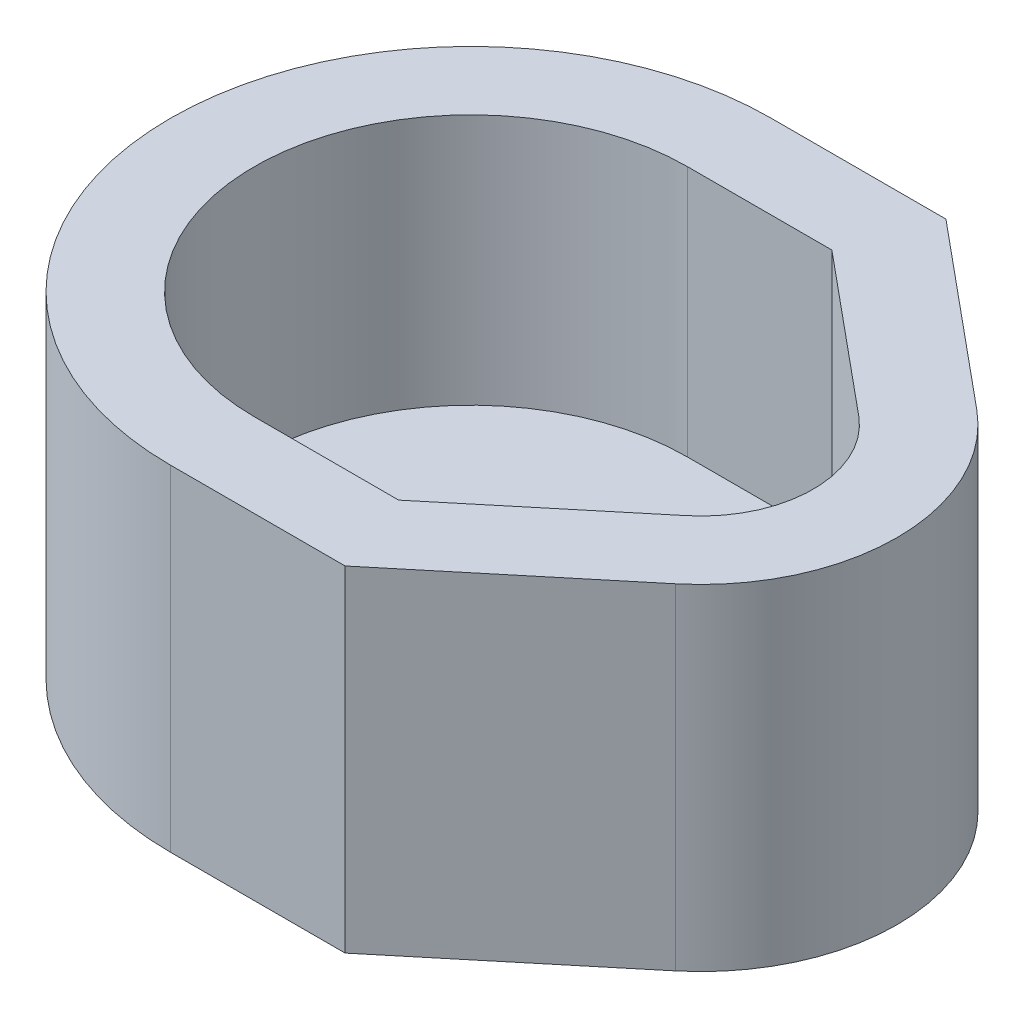
ISO-10303-21;
HEADER;
FILE_DESCRIPTION(('STEP AP214'),'2;1');
FILE_NAME('part.step','',(''),(''),'','','');
FILE_SCHEMA(('AUTOMOTIVE_DESIGN { 1 0 10303 214 1 1 1 1 }'));
ENDSEC;
DATA;
#1=APPLICATION_CONTEXT('core data for automotive mechanical design processes');
#2=APPLICATION_PROTOCOL_DEFINITION('international standard','automotive_design',2000,#1);
#3=PRODUCT_CONTEXT('',#1,'mechanical');
#4=PRODUCT('Part','Part','',(#3));
#5=PRODUCT_RELATED_PRODUCT_CATEGORY('part','',(#4));
#6=PRODUCT_DEFINITION_FORMATION('','',#4);
#7=PRODUCT_DEFINITION_CONTEXT('part definition',#1,'design');
#8=PRODUCT_DEFINITION('design','',#6,#7);
#9=PRODUCT_DEFINITION_SHAPE('','',#8);
#10=(LENGTH_UNIT() NAMED_UNIT(*) SI_UNIT(.MILLI.,.METRE.));
#11=(NAMED_UNIT(*) PLANE_ANGLE_UNIT() SI_UNIT($,.RADIAN.));
#12=(NAMED_UNIT(*) SI_UNIT($,.STERADIAN.) SOLID_ANGLE_UNIT());
#13=UNCERTAINTY_MEASURE_WITH_UNIT(LENGTH_MEASURE(1.E-05),#10,'distance_accuracy_value','');
#14=(GEOMETRIC_REPRESENTATION_CONTEXT(3) GLOBAL_UNCERTAINTY_ASSIGNED_CONTEXT((#13)) GLOBAL_UNIT_ASSIGNED_CONTEXT((#10,
#11,#12)) REPRESENTATION_CONTEXT('',''));
#15=CARTESIAN_POINT('',(0.,0.,0.));
#16=DIRECTION('',(0.,0.,1.));
#17=DIRECTION('',(1.,0.,0.));
#18=AXIS2_PLACEMENT_3D('',#15,#16,#17);
#19=CARTESIAN_POINT('',(0.,25.4,-22.7584));
#20=DIRECTION('',(0.,-1.,0.));
#21=DIRECTION('',(0.,0.,-1.));
#22=AXIS2_PLACEMENT_3D('',#19,#20,#21);
#23=CYLINDRICAL_SURFACE('',#22,22.7584);
#24=CARTESIAN_POINT('',(0.,0.,-22.7584));
#25=DIRECTION('',(0.,1.,0.));
#26=DIRECTION('',(0.,0.,1.));
#27=AXIS2_PLACEMENT_3D('',#24,#25,#26);
#28=CIRCLE('',#27,22.7584);
#29=CARTESIAN_POINT('',(0.,0.,-45.5168));
#30=VERTEX_POINT('',#29);
#31=CARTESIAN_POINT('',(0.,0.,0.));
#32=VERTEX_POINT('',#31);
#33=EDGE_CURVE('E134',#30,#32,#28,.T.);
#34=ORIENTED_EDGE('',*,*,#33,.T.);
#35=DIRECTION('',(0.,-1.,0.));
#36=VECTOR('',#35,1.);
#37=CARTESIAN_POINT('',(0.,25.4,0.));
#38=LINE('',#37,#36);
#39=CARTESIAN_POINT('',(0.,25.4,0.));
#40=VERTEX_POINT('',#39);
#41=EDGE_CURVE('E11',#40,#32,#38,.T.);
#42=ORIENTED_EDGE('',*,*,#41,.F.);
#43=CARTESIAN_POINT('',(0.,25.4,-22.7584));
#44=DIRECTION('',(0.,1.,0.));
#45=DIRECTION('',(0.,0.,1.));
#46=AXIS2_PLACEMENT_3D('',#43,#44,#45);
#47=CIRCLE('',#46,22.7584);
#48=CARTESIAN_POINT('',(0.,25.4,-45.5168));
#49=VERTEX_POINT('',#48);
#50=EDGE_CURVE('E146',#49,#40,#47,.T.);
#51=ORIENTED_EDGE('',*,*,#50,.F.);
#52=DIRECTION('',(0.,-1.,0.));
#53=VECTOR('',#52,1.);
#54=CARTESIAN_POINT('',(0.,25.4,-45.5168));
#55=LINE('',#54,#53);
#56=EDGE_CURVE('E130',#49,#30,#55,.T.);
#57=ORIENTED_EDGE('',*,*,#56,.T.);
#58=EDGE_LOOP('',(#34,#42,#51,#57));
#59=FACE_BOUND('',#58,.T.);
#60=ADVANCED_FACE('F39',(#59),#23,.T.);
#61=CARTESIAN_POINT('',(0.,25.4,0.));
#62=DIRECTION('',(0.,0.,-1.));
#63=DIRECTION('',(-1.,0.,0.));
#64=AXIS2_PLACEMENT_3D('',#61,#62,#63);
#65=PLANE('',#64);
#66=DIRECTION('',(1.,0.,0.));
#67=VECTOR('',#66,1.);
#68=CARTESIAN_POINT('',(0.,0.,0.));
#69=LINE('',#68,#67);
#70=CARTESIAN_POINT('',(13.2334,0.,0.));
#71=VERTEX_POINT('',#70);
#72=EDGE_CURVE('E137',#32,#71,#69,.T.);
#73=ORIENTED_EDGE('',*,*,#72,.T.);
#74=DIRECTION('',(0.,-1.,0.));
#75=VECTOR('',#74,1.);
#76=CARTESIAN_POINT('',(13.2334,25.4,0.));
#77=LINE('',#76,#75);
#78=CARTESIAN_POINT('',(13.2334,25.4,0.));
#79=VERTEX_POINT('',#78);
#80=EDGE_CURVE('E46',#79,#71,#77,.T.);
#81=ORIENTED_EDGE('',*,*,#80,.F.);
#82=DIRECTION('',(1.,0.,0.));
#83=VECTOR('',#82,1.);
#84=CARTESIAN_POINT('',(0.,25.4,0.));
#85=LINE('',#84,#83);
#86=EDGE_CURVE('E97',#40,#79,#85,.T.);
#87=ORIENTED_EDGE('',*,*,#86,.F.);
#88=ORIENTED_EDGE('',*,*,#41,.T.);
#89=EDGE_LOOP('',(#73,#81,#87,#88));
#90=FACE_BOUND('',#89,.T.);
#91=ADVANCED_FACE('F296',(#90),#65,.F.);
#92=CARTESIAN_POINT('',(13.2334,25.4,0.));
#93=DIRECTION('',(-0.638248134360733,0.,-0.769830708003418));
#94=DIRECTION('',(-0.769830708003418,0.,0.638248134360733));
#95=AXIS2_PLACEMENT_3D('',#92,#93,#94);
#96=PLANE('',#95);
#97=DIRECTION('',(0.769830708003418,0.,-0.638248134360733));
#98=VECTOR('',#97,1.);
#99=CARTESIAN_POINT('',(13.2334,0.,0.));
#100=LINE('',#99,#98);
#101=CARTESIAN_POINT('',(26.921911774547,0.,-11.3488160597521));
#102=VERTEX_POINT('',#101);
#103=EDGE_CURVE('E140',#71,#102,#100,.T.);
#104=ORIENTED_EDGE('',*,*,#103,.T.);
#105=DIRECTION('',(0.,-1.,0.));
#106=VECTOR('',#105,1.);
#107=CARTESIAN_POINT('',(26.921911774547,25.4,-11.3488160597521));
#108=LINE('',#107,#106);
#109=CARTESIAN_POINT('',(26.921911774547,25.4,-11.3488160597521));
#110=VERTEX_POINT('',#109);
#111=EDGE_CURVE('E125',#110,#102,#108,.T.);
#112=ORIENTED_EDGE('',*,*,#111,.F.);
#113=DIRECTION('',(0.769830708003418,0.,-0.638248134360733));
#114=VECTOR('',#113,1.);
#115=CARTESIAN_POINT('',(13.2334,25.4,0.));
#116=LINE('',#115,#114);
#117=EDGE_CURVE('E113',#79,#110,#116,.T.);
#118=ORIENTED_EDGE('',*,*,#117,.F.);
#119=ORIENTED_EDGE('',*,*,#80,.T.);
#120=EDGE_LOOP('',(#104,#112,#118,#119));
#121=FACE_BOUND('',#120,.T.);
#122=ADVANCED_FACE('F152',(#121),#96,.F.);
#123=CARTESIAN_POINT('',(17.4625,25.4,-22.7584));
#124=DIRECTION('',(0.,-1.,0.));
#125=DIRECTION('',(0.,0.,-1.));
#126=AXIS2_PLACEMENT_3D('',#123,#124,#125);
#127=CYLINDRICAL_SURFACE('',#126,14.8209);
#128=CARTESIAN_POINT('',(17.4625,0.,-22.7584));
#129=DIRECTION('',(0.,1.,0.));
#130=DIRECTION('',(0.,0.,1.));
#131=AXIS2_PLACEMENT_3D('',#128,#129,#130);
#132=CIRCLE('',#131,14.8209);
#133=CARTESIAN_POINT('',(26.921911774547,0.,-34.1679839402478));
#134=VERTEX_POINT('',#133);
#135=EDGE_CURVE('E122',#102,#134,#132,.T.);
#136=ORIENTED_EDGE('',*,*,#135,.T.);
#137=DIRECTION('',(0.,-1.,0.));
#138=VECTOR('',#137,1.);
#139=CARTESIAN_POINT('',(26.921911774547,25.4,-34.1679839402478));
#140=LINE('',#139,#138);
#141=CARTESIAN_POINT('',(26.921911774547,25.4,-34.1679839402478));
#142=VERTEX_POINT('',#141);
#143=EDGE_CURVE('E119',#142,#134,#140,.T.);
#144=ORIENTED_EDGE('',*,*,#143,.F.);
#145=CARTESIAN_POINT('',(17.4625,25.4,-22.7584));
#146=DIRECTION('',(0.,1.,0.));
#147=DIRECTION('',(0.,0.,1.));
#148=AXIS2_PLACEMENT_3D('',#145,#146,#147);
#149=CIRCLE('',#148,14.8209);
#150=EDGE_CURVE('E106',#110,#142,#149,.T.);
#151=ORIENTED_EDGE('',*,*,#150,.F.);
#152=ORIENTED_EDGE('',*,*,#111,.T.);
#153=EDGE_LOOP('',(#136,#144,#151,#152));
#154=FACE_BOUND('',#153,.T.);
#155=ADVANCED_FACE('F120',(#154),#127,.T.);
#156=CARTESIAN_POINT('',(26.921911774547,25.4,-34.1679839402478));
#157=DIRECTION('',(-0.638248134360736,0.,0.769830708003416));
#158=DIRECTION('',(0.769830708003416,0.,0.638248134360736));
#159=AXIS2_PLACEMENT_3D('',#156,#157,#158);
#160=PLANE('',#159);
#161=DIRECTION('',(-0.769830708003416,0.,-0.638248134360736));
#162=VECTOR('',#161,1.);
#163=CARTESIAN_POINT('',(26.921911774547,0.,-34.1679839402478));
#164=LINE('',#163,#162);
#165=CARTESIAN_POINT('',(13.2334000000001,0.,-45.5168));
#166=VERTEX_POINT('',#165);
#167=EDGE_CURVE('E143',#134,#166,#164,.T.);
#168=ORIENTED_EDGE('',*,*,#167,.T.);
#169=DIRECTION('',(0.,-1.,0.));
#170=VECTOR('',#169,1.);
#171=CARTESIAN_POINT('',(13.2334000000001,25.4,-45.5168));
#172=LINE('',#171,#170);
#173=CARTESIAN_POINT('',(13.2334000000001,25.4,-45.5168));
#174=VERTEX_POINT('',#173);
#175=EDGE_CURVE('E126',#174,#166,#172,.T.);
#176=ORIENTED_EDGE('',*,*,#175,.F.);
#177=DIRECTION('',(-0.769830708003416,0.,-0.638248134360736));
#178=VECTOR('',#177,1.);
#179=CARTESIAN_POINT('',(26.921911774547,25.4,-34.1679839402478));
#180=LINE('',#179,#178);
#181=EDGE_CURVE('E110',#142,#174,#180,.T.);
#182=ORIENTED_EDGE('',*,*,#181,.F.);
#183=ORIENTED_EDGE('',*,*,#143,.T.);
#184=EDGE_LOOP('',(#168,#176,#182,#183));
#185=FACE_BOUND('',#184,.T.);
#186=ADVANCED_FACE('F128',(#185),#160,.F.);
#187=CARTESIAN_POINT('',(0.,25.4,-45.5168));
#188=DIRECTION('',(0.,0.,1.));
#189=DIRECTION('',(1.,0.,0.));
#190=AXIS2_PLACEMENT_3D('',#187,#188,#189);
#191=PLANE('',#190);
#192=DIRECTION('',(-1.,0.,0.));
#193=VECTOR('',#192,1.);
#194=CARTESIAN_POINT('',(0.,0.,-45.5168));
#195=LINE('',#194,#193);
#196=EDGE_CURVE('E89',#166,#30,#195,.T.);
#197=ORIENTED_EDGE('',*,*,#196,.T.);
#198=ORIENTED_EDGE('',*,*,#56,.F.);
#199=DIRECTION('',(-1.,0.,0.));
#200=VECTOR('',#199,1.);
#201=CARTESIAN_POINT('',(0.,25.4,-45.5168));
#202=LINE('',#201,#200);
#203=EDGE_CURVE('E62',#174,#49,#202,.T.);
#204=ORIENTED_EDGE('',*,*,#203,.F.);
#205=ORIENTED_EDGE('',*,*,#175,.T.);
#206=EDGE_LOOP('',(#197,#198,#204,#205));
#207=FACE_BOUND('',#206,.T.);
#208=ADVANCED_FACE('F156',(#207),#191,.F.);
#209=CARTESIAN_POINT('',(0.,25.4,-22.7584));
#210=DIRECTION('',(0.,1.,0.));
#211=DIRECTION('',(0.,0.,1.));
#212=AXIS2_PLACEMENT_3D('',#209,#210,#211);
#213=PLANE('',#212);
#214=CARTESIAN_POINT('',(0.,25.4,-22.7584));
#215=DIRECTION('',(0.,1.,0.));
#216=DIRECTION('',(0.,0.,1.));
#217=AXIS2_PLACEMENT_3D('',#214,#215,#216);
#218=CIRCLE('',#217,16.4084);
#219=CARTESIAN_POINT('',(0.,25.4,-39.1668));
#220=VERTEX_POINT('',#219);
#221=CARTESIAN_POINT('',(0.,25.4,-6.35));
#222=VERTEX_POINT('',#221);
#223=EDGE_CURVE('E177',#220,#222,#218,.T.);
#224=ORIENTED_EDGE('',*,*,#223,.F.);
#225=DIRECTION('',(-1.,0.,0.));
#226=VECTOR('',#225,1.);
#227=CARTESIAN_POINT('',(0.,25.4,-39.1668));
#228=LINE('',#227,#226);
#229=CARTESIAN_POINT('',(10.9434207184434,25.4,-39.1668));
#230=VERTEX_POINT('',#229);
#231=EDGE_CURVE('E163',#230,#220,#228,.T.);
#232=ORIENTED_EDGE('',*,*,#231,.F.);
#233=DIRECTION('',(-0.769830708003416,0.,-0.638248134360736));
#234=VECTOR('',#233,1.);
#235=CARTESIAN_POINT('',(22.8690361213564,25.4,-29.2795589444261));
#236=LINE('',#235,#234);
#237=CARTESIAN_POINT('',(22.8690361213564,25.4,-29.2795589444261));
#238=VERTEX_POINT('',#237);
#239=EDGE_CURVE('E166',#238,#230,#236,.T.);
#240=ORIENTED_EDGE('',*,*,#239,.F.);
#241=CARTESIAN_POINT('',(17.4625,25.4,-22.7584));
#242=DIRECTION('',(0.,1.,0.));
#243=DIRECTION('',(0.,0.,1.));
#244=AXIS2_PLACEMENT_3D('',#241,#242,#243);
#245=CIRCLE('',#244,8.4709);
#246=CARTESIAN_POINT('',(22.8690361213563,25.4,-16.2372410555739));
#247=VERTEX_POINT('',#246);
#248=EDGE_CURVE('E168',#247,#238,#245,.T.);
#249=ORIENTED_EDGE('',*,*,#248,.F.);
#250=DIRECTION('',(0.769830708003418,0.,-0.638248134360733));
#251=VECTOR('',#250,1.);
#252=CARTESIAN_POINT('',(9.18052434680934,25.4,-4.8884249958217));
#253=LINE('',#252,#251);
#254=CARTESIAN_POINT('',(10.9434207184433,25.4,-6.35));
#255=VERTEX_POINT('',#254);
#256=EDGE_CURVE('E171',#255,#247,#253,.T.);
#257=ORIENTED_EDGE('',*,*,#256,.F.);
#258=DIRECTION('',(1.,0.,0.));
#259=VECTOR('',#258,1.);
#260=CARTESIAN_POINT('',(0.,25.4,-6.35));
#261=LINE('',#260,#259);
#262=EDGE_CURVE('E174',#222,#255,#261,.T.);
#263=ORIENTED_EDGE('',*,*,#262,.F.);
#264=EDGE_LOOP('',(#224,#232,#240,#249,#257,#263));
#265=FACE_BOUND('',#264,.T.);
#266=ORIENTED_EDGE('',*,*,#50,.T.);
#267=ORIENTED_EDGE('',*,*,#86,.T.);
#268=ORIENTED_EDGE('',*,*,#117,.T.);
#269=ORIENTED_EDGE('',*,*,#150,.T.);
#270=ORIENTED_EDGE('',*,*,#181,.T.);
#271=ORIENTED_EDGE('',*,*,#203,.T.);
#272=EDGE_LOOP('',(#266,#267,#268,#269,#270,#271));
#273=FACE_BOUND('',#272,.T.);
#274=ADVANCED_FACE('F108',(#265,#273),#213,.T.);
#275=CARTESIAN_POINT('',(0.,0.,-22.7584));
#276=DIRECTION('',(0.,1.,0.));
#277=DIRECTION('',(0.,0.,1.));
#278=AXIS2_PLACEMENT_3D('',#275,#276,#277);
#279=PLANE('',#278);
#280=CARTESIAN_POINT('',(0.,0.,-22.7584));
#281=DIRECTION('',(0.,1.,0.));
#282=DIRECTION('',(0.,0.,1.));
#283=AXIS2_PLACEMENT_3D('',#280,#281,#282);
#284=CIRCLE('',#283,3.98145);
#285=CARTESIAN_POINT('',(0.,0.,-18.77695));
#286=VERTEX_POINT('',#285);
#287=EDGE_CURVE('E212',#286,#286,#284,.T.);
#288=ORIENTED_EDGE('',*,*,#287,.T.);
#289=EDGE_LOOP('',(#288));
#290=FACE_BOUND('',#289,.T.);
#291=CARTESIAN_POINT('',(17.4625,0.,-22.7584));
#292=DIRECTION('',(0.,1.,0.));
#293=DIRECTION('',(0.,0.,1.));
#294=AXIS2_PLACEMENT_3D('',#291,#292,#293);
#295=CIRCLE('',#294,3.1877);
#296=CARTESIAN_POINT('',(17.4625,0.,-19.5707));
#297=VERTEX_POINT('',#296);
#298=EDGE_CURVE('E213',#297,#297,#295,.T.);
#299=ORIENTED_EDGE('',*,*,#298,.T.);
#300=EDGE_LOOP('',(#299));
#301=FACE_BOUND('',#300,.T.);
#302=ORIENTED_EDGE('',*,*,#33,.F.);
#303=ORIENTED_EDGE('',*,*,#196,.F.);
#304=ORIENTED_EDGE('',*,*,#167,.F.);
#305=ORIENTED_EDGE('',*,*,#135,.F.);
#306=ORIENTED_EDGE('',*,*,#103,.F.);
#307=ORIENTED_EDGE('',*,*,#72,.F.);
#308=EDGE_LOOP('',(#302,#303,#304,#305,#306,#307));
#309=FACE_BOUND('',#308,.T.);
#310=ADVANCED_FACE('F155',(#290,#301,#309),#279,.F.);
#311=CARTESIAN_POINT('',(0.,25.4,-22.7584));
#312=DIRECTION('',(0.,-1.,0.));
#313=DIRECTION('',(0.,0.,-1.));
#314=AXIS2_PLACEMENT_3D('',#311,#312,#313);
#315=CYLINDRICAL_SURFACE('',#314,16.4084);
#316=CARTESIAN_POINT('',(0.,6.35,-22.7584));
#317=DIRECTION('',(0.,1.,0.));
#318=DIRECTION('',(0.,0.,1.));
#319=AXIS2_PLACEMENT_3D('',#316,#317,#318);
#320=CIRCLE('',#319,16.4084);
#321=CARTESIAN_POINT('',(0.,6.35,-39.1668));
#322=VERTEX_POINT('',#321);
#323=CARTESIAN_POINT('',(0.,6.35,-6.35));
#324=VERTEX_POINT('',#323);
#325=EDGE_CURVE('E205',#322,#324,#320,.T.);
#326=ORIENTED_EDGE('',*,*,#325,.F.);
#327=DIRECTION('',(0.,-1.,0.));
#328=VECTOR('',#327,1.);
#329=CARTESIAN_POINT('',(0.,25.4,-39.1668));
#330=LINE('',#329,#328);
#331=EDGE_CURVE('E165',#220,#322,#330,.T.);
#332=ORIENTED_EDGE('',*,*,#331,.F.);
#333=ORIENTED_EDGE('',*,*,#223,.T.);
#334=DIRECTION('',(0.,1.,0.));
#335=VECTOR('',#334,1.);
#336=CARTESIAN_POINT('',(0.,25.4,-6.35));
#337=LINE('',#336,#335);
#338=EDGE_CURVE('E138',#222,#324,#337,.F.);
#339=ORIENTED_EDGE('',*,*,#338,.T.);
#340=EDGE_LOOP('',(#326,#332,#333,#339));
#341=FACE_BOUND('',#340,.T.);
#342=ADVANCED_FACE('F249',(#341),#315,.F.);
#343=CARTESIAN_POINT('',(0.,25.4,-6.35));
#344=DIRECTION('',(0.,0.,-1.));
#345=DIRECTION('',(-1.,0.,0.));
#346=AXIS2_PLACEMENT_3D('',#343,#344,#345);
#347=PLANE('',#346);
#348=DIRECTION('',(1.,0.,0.));
#349=VECTOR('',#348,1.);
#350=CARTESIAN_POINT('',(0.,6.35,-6.35));
#351=LINE('',#350,#349);
#352=CARTESIAN_POINT('',(10.9434207184433,6.35,-6.35));
#353=VERTEX_POINT('',#352);
#354=EDGE_CURVE('E200',#324,#353,#351,.T.);
#355=ORIENTED_EDGE('',*,*,#354,.F.);
#356=ORIENTED_EDGE('',*,*,#338,.F.);
#357=ORIENTED_EDGE('',*,*,#262,.T.);
#358=DIRECTION('',(0.,-1.,0.));
#359=VECTOR('',#358,1.);
#360=CARTESIAN_POINT('',(10.9434207184433,25.4,-6.35));
#361=LINE('',#360,#359);
#362=EDGE_CURVE('E197',#255,#353,#361,.T.);
#363=ORIENTED_EDGE('',*,*,#362,.T.);
#364=EDGE_LOOP('',(#355,#356,#357,#363));
#365=FACE_BOUND('',#364,.T.);
#366=ADVANCED_FACE('F274',(#365),#347,.T.);
#367=CARTESIAN_POINT('',(9.18052434680934,25.4,-4.8884249958217));
#368=DIRECTION('',(-0.638248134360733,0.,-0.769830708003418));
#369=DIRECTION('',(-0.769830708003418,0.,0.638248134360733));
#370=AXIS2_PLACEMENT_3D('',#367,#368,#369);
#371=PLANE('',#370);
#372=DIRECTION('',(0.769830708003418,0.,-0.638248134360733));
#373=VECTOR('',#372,1.);
#374=CARTESIAN_POINT('',(9.18052434680934,6.35,-4.8884249958217));
#375=LINE('',#374,#373);
#376=CARTESIAN_POINT('',(22.8690361213563,6.35,-16.2372410555739));
#377=VERTEX_POINT('',#376);
#378=EDGE_CURVE('E194',#353,#377,#375,.T.);
#379=ORIENTED_EDGE('',*,*,#378,.F.);
#380=ORIENTED_EDGE('',*,*,#362,.F.);
#381=ORIENTED_EDGE('',*,*,#256,.T.);
#382=DIRECTION('',(0.,-1.,0.));
#383=VECTOR('',#382,1.);
#384=CARTESIAN_POINT('',(22.8690361213563,25.4,-16.2372410555739));
#385=LINE('',#384,#383);
#386=EDGE_CURVE('E191',#247,#377,#385,.T.);
#387=ORIENTED_EDGE('',*,*,#386,.T.);
#388=EDGE_LOOP('',(#379,#380,#381,#387));
#389=FACE_BOUND('',#388,.T.);
#390=ADVANCED_FACE('F280',(#389),#371,.T.);
#391=CARTESIAN_POINT('',(17.4625,25.4,-22.7584));
#392=DIRECTION('',(0.,-1.,0.));
#393=DIRECTION('',(0.,0.,-1.));
#394=AXIS2_PLACEMENT_3D('',#391,#392,#393);
#395=CYLINDRICAL_SURFACE('',#394,8.4709);
#396=CARTESIAN_POINT('',(17.4625,6.35,-22.7584));
#397=DIRECTION('',(0.,1.,0.));
#398=DIRECTION('',(0.,0.,1.));
#399=AXIS2_PLACEMENT_3D('',#396,#397,#398);
#400=CIRCLE('',#399,8.4709);
#401=CARTESIAN_POINT('',(22.8690361213564,6.35,-29.2795589444261));
#402=VERTEX_POINT('',#401);
#403=EDGE_CURVE('E188',#377,#402,#400,.T.);
#404=ORIENTED_EDGE('',*,*,#403,.F.);
#405=ORIENTED_EDGE('',*,*,#386,.F.);
#406=ORIENTED_EDGE('',*,*,#248,.T.);
#407=DIRECTION('',(0.,1.,0.));
#408=VECTOR('',#407,1.);
#409=CARTESIAN_POINT('',(22.8690361213564,25.4,-29.2795589444261));
#410=LINE('',#409,#408);
#411=EDGE_CURVE('E185',#238,#402,#410,.F.);
#412=ORIENTED_EDGE('',*,*,#411,.T.);
#413=EDGE_LOOP('',(#404,#405,#406,#412));
#414=FACE_BOUND('',#413,.T.);
#415=ADVANCED_FACE('F284',(#414),#395,.F.);
#416=CARTESIAN_POINT('',(22.8690361213564,25.4,-29.2795589444261));
#417=DIRECTION('',(-0.638248134360736,0.,0.769830708003416));
#418=DIRECTION('',(0.769830708003416,0.,0.638248134360736));
#419=AXIS2_PLACEMENT_3D('',#416,#417,#418);
#420=PLANE('',#419);
#421=DIRECTION('',(-0.769830708003416,0.,-0.638248134360736));
#422=VECTOR('',#421,1.);
#423=CARTESIAN_POINT('',(22.8690361213564,6.35,-29.2795589444261));
#424=LINE('',#423,#422);
#425=CARTESIAN_POINT('',(10.9434207184434,6.35,-39.1668));
#426=VERTEX_POINT('',#425);
#427=EDGE_CURVE('E183',#402,#426,#424,.T.);
#428=ORIENTED_EDGE('',*,*,#427,.F.);
#429=ORIENTED_EDGE('',*,*,#411,.F.);
#430=ORIENTED_EDGE('',*,*,#239,.T.);
#431=DIRECTION('',(0.,-1.,0.));
#432=VECTOR('',#431,1.);
#433=CARTESIAN_POINT('',(10.9434207184434,25.4,-39.1668));
#434=LINE('',#433,#432);
#435=EDGE_CURVE('E53',#230,#426,#434,.T.);
#436=ORIENTED_EDGE('',*,*,#435,.T.);
#437=EDGE_LOOP('',(#428,#429,#430,#436));
#438=FACE_BOUND('',#437,.T.);
#439=ADVANCED_FACE('F286',(#438),#420,.T.);
#440=CARTESIAN_POINT('',(0.,25.4,-39.1668));
#441=DIRECTION('',(0.,0.,1.));
#442=DIRECTION('',(1.,0.,0.));
#443=AXIS2_PLACEMENT_3D('',#440,#441,#442);
#444=PLANE('',#443);
#445=DIRECTION('',(-1.,0.,0.));
#446=VECTOR('',#445,1.);
#447=CARTESIAN_POINT('',(0.,6.35,-39.1668));
#448=LINE('',#447,#446);
#449=EDGE_CURVE('E180',#426,#322,#448,.T.);
#450=ORIENTED_EDGE('',*,*,#449,.F.);
#451=ORIENTED_EDGE('',*,*,#435,.F.);
#452=ORIENTED_EDGE('',*,*,#231,.T.);
#453=ORIENTED_EDGE('',*,*,#331,.T.);
#454=EDGE_LOOP('',(#450,#451,#452,#453));
#455=FACE_BOUND('',#454,.T.);
#456=ADVANCED_FACE('F237',(#455),#444,.T.);
#457=CARTESIAN_POINT('',(0.,6.35,-22.7584));
#458=DIRECTION('',(0.,1.,0.));
#459=DIRECTION('',(0.,0.,1.));
#460=AXIS2_PLACEMENT_3D('',#457,#458,#459);
#461=PLANE('',#460);
#462=CARTESIAN_POINT('',(0.,6.35,-22.7584));
#463=DIRECTION('',(0.,1.,0.));
#464=DIRECTION('',(0.,0.,1.));
#465=AXIS2_PLACEMENT_3D('',#462,#463,#464);
#466=CIRCLE('',#465,3.98145);
#467=CARTESIAN_POINT('',(0.,6.35,-18.77695));
#468=VERTEX_POINT('',#467);
#469=EDGE_CURVE('E219',#468,#468,#466,.T.);
#470=ORIENTED_EDGE('',*,*,#469,.F.);
#471=EDGE_LOOP('',(#470));
#472=FACE_BOUND('',#471,.T.);
#473=CARTESIAN_POINT('',(17.4625,6.35,-22.7584));
#474=DIRECTION('',(0.,1.,0.));
#475=DIRECTION('',(0.,0.,1.));
#476=AXIS2_PLACEMENT_3D('',#473,#474,#475);
#477=CIRCLE('',#476,3.1877);
#478=CARTESIAN_POINT('',(17.4625,6.35,-19.5707));
#479=VERTEX_POINT('',#478);
#480=EDGE_CURVE('E216',#479,#479,#477,.T.);
#481=ORIENTED_EDGE('',*,*,#480,.F.);
#482=EDGE_LOOP('',(#481));
#483=FACE_BOUND('',#482,.T.);
#484=ORIENTED_EDGE('',*,*,#325,.T.);
#485=ORIENTED_EDGE('',*,*,#354,.T.);
#486=ORIENTED_EDGE('',*,*,#378,.T.);
#487=ORIENTED_EDGE('',*,*,#403,.T.);
#488=ORIENTED_EDGE('',*,*,#427,.T.);
#489=ORIENTED_EDGE('',*,*,#449,.T.);
#490=EDGE_LOOP('',(#484,#485,#486,#487,#488,#489));
#491=FACE_BOUND('',#490,.T.);
#492=ADVANCED_FACE('F234',(#472,#483,#491),#461,.T.);
#493=CARTESIAN_POINT('',(17.4625,0.,-22.7584));
#494=DIRECTION('',(0.,1.,0.));
#495=DIRECTION('',(0.,0.,1.));
#496=AXIS2_PLACEMENT_3D('',#493,#494,#495);
#497=CYLINDRICAL_SURFACE('',#496,3.1877);
#498=ORIENTED_EDGE('',*,*,#298,.F.);
#499=EDGE_LOOP('',(#498));
#500=FACE_BOUND('',#499,.T.);
#501=ORIENTED_EDGE('',*,*,#480,.T.);
#502=EDGE_LOOP('',(#501));
#503=FACE_BOUND('',#502,.T.);
#504=ADVANCED_FACE('F230',(#500,#503),#497,.F.);
#505=CARTESIAN_POINT('',(0.,0.,-22.7584));
#506=DIRECTION('',(0.,1.,0.));
#507=DIRECTION('',(0.,0.,1.));
#508=AXIS2_PLACEMENT_3D('',#505,#506,#507);
#509=CYLINDRICAL_SURFACE('',#508,3.98145);
#510=ORIENTED_EDGE('',*,*,#287,.F.);
#511=EDGE_LOOP('',(#510));
#512=FACE_BOUND('',#511,.T.);
#513=ORIENTED_EDGE('',*,*,#469,.T.);
#514=EDGE_LOOP('',(#513));
#515=FACE_BOUND('',#514,.T.);
#516=ADVANCED_FACE('F227',(#512,#515),#509,.F.);
#517=CLOSED_SHELL('',(#60,#91,#122,#155,#186,#208,#274,#310,#342,#366,#390,#415,#439,#456,#492,
#504,#516));
#518=MANIFOLD_SOLID_BREP('B2',#517);
#519=ADVANCED_BREP_SHAPE_REPRESENTATION('',(#18,#518),#14);
#520=SHAPE_DEFINITION_REPRESENTATION(#9,#519);
ENDSEC;
END-ISO-10303-21;
